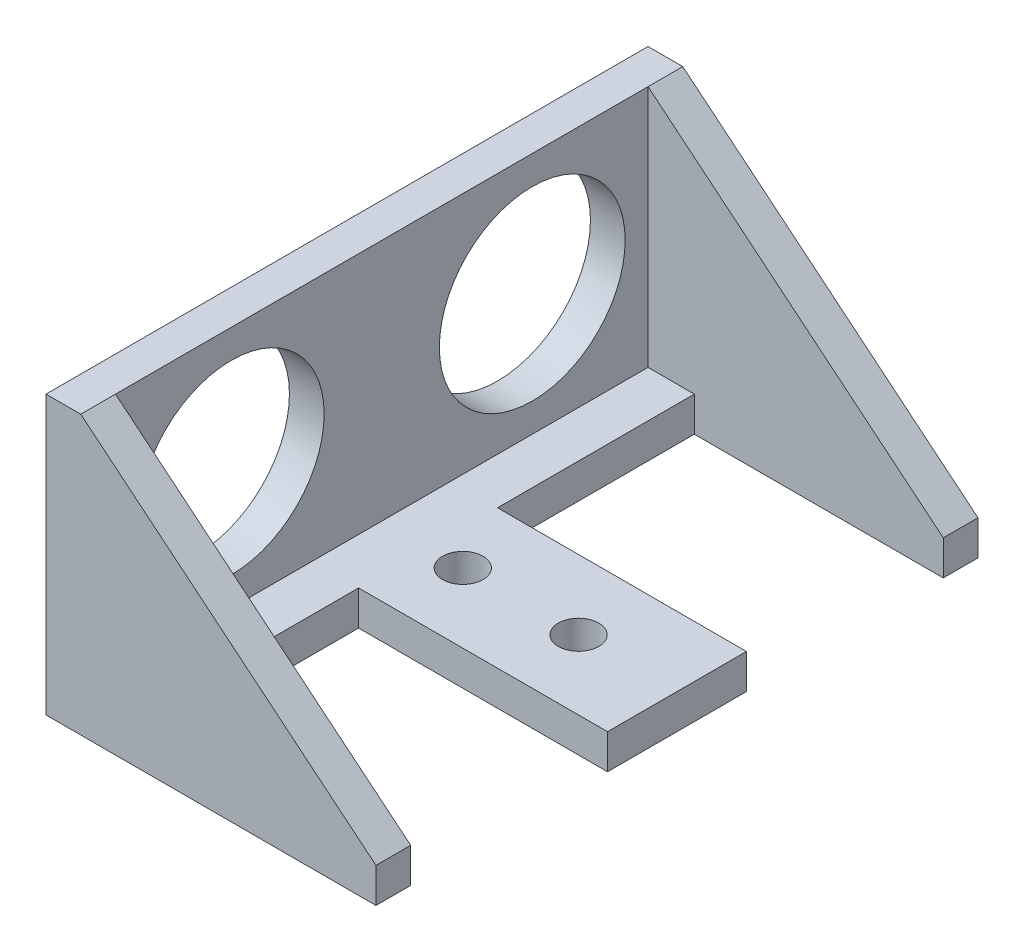
ISO-10303-21;
HEADER;
FILE_DESCRIPTION(('STEP AP214'),'2;1');
FILE_NAME('part.step','',(''),(''),'','','');
FILE_SCHEMA(('AUTOMOTIVE_DESIGN { 1 0 10303 214 1 1 1 1 }'));
ENDSEC;
DATA;
#1=APPLICATION_CONTEXT('core data for automotive mechanical design processes');
#2=APPLICATION_PROTOCOL_DEFINITION('international standard','automotive_design',2000,#1);
#3=PRODUCT_CONTEXT('',#1,'mechanical');
#4=PRODUCT('Part','Part','',(#3));
#5=PRODUCT_RELATED_PRODUCT_CATEGORY('part','',(#4));
#6=PRODUCT_DEFINITION_FORMATION('','',#4);
#7=PRODUCT_DEFINITION_CONTEXT('part definition',#1,'design');
#8=PRODUCT_DEFINITION('design','',#6,#7);
#9=PRODUCT_DEFINITION_SHAPE('','',#8);
#10=(LENGTH_UNIT() NAMED_UNIT(*) SI_UNIT(.MILLI.,.METRE.));
#11=(NAMED_UNIT(*) PLANE_ANGLE_UNIT() SI_UNIT($,.RADIAN.));
#12=(NAMED_UNIT(*) SI_UNIT($,.STERADIAN.) SOLID_ANGLE_UNIT());
#13=UNCERTAINTY_MEASURE_WITH_UNIT(LENGTH_MEASURE(1.E-05),#10,'distance_accuracy_value','');
#14=(GEOMETRIC_REPRESENTATION_CONTEXT(3) GLOBAL_UNCERTAINTY_ASSIGNED_CONTEXT((#13)) GLOBAL_UNIT_ASSIGNED_CONTEXT((#10,
#11,#12)) REPRESENTATION_CONTEXT('',''));
#15=CARTESIAN_POINT('',(0.,0.,0.));
#16=DIRECTION('',(0.,0.,1.));
#17=DIRECTION('',(1.,0.,0.));
#18=AXIS2_PLACEMENT_3D('',#15,#16,#17);
#19=CARTESIAN_POINT('',(28.5,0.,0.));
#20=DIRECTION('',(-1.,0.,0.));
#21=DIRECTION('',(0.,0.,1.));
#22=AXIS2_PLACEMENT_3D('',#19,#20,#21);
#23=PLANE('',#22);
#24=DIRECTION('',(0.,0.,1.));
#25=VECTOR('',#24,1.);
#26=CARTESIAN_POINT('',(28.5,-10.5,-39.));
#27=LINE('',#26,#25);
#28=CARTESIAN_POINT('',(28.5,-10.5,-39.));
#29=VERTEX_POINT('',#28);
#30=CARTESIAN_POINT('',(28.5,-10.5,-36.));
#31=VERTEX_POINT('',#30);
#32=EDGE_CURVE('E256',#29,#31,#27,.T.);
#33=ORIENTED_EDGE('',*,*,#32,.T.);
#34=DIRECTION('',(0.,1.,0.));
#35=VECTOR('',#34,1.);
#36=CARTESIAN_POINT('',(28.5,-13.5,-36.));
#37=LINE('',#36,#35);
#38=CARTESIAN_POINT('',(28.5,-13.5,-36.));
#39=VERTEX_POINT('',#38);
#40=EDGE_CURVE('E215',#39,#31,#37,.T.);
#41=ORIENTED_EDGE('',*,*,#40,.F.);
#42=DIRECTION('',(0.,0.,1.));
#43=VECTOR('',#42,1.);
#44=CARTESIAN_POINT('',(28.5,-13.5,0.));
#45=LINE('',#44,#43);
#46=CARTESIAN_POINT('',(28.5,-13.5,-39.));
#47=VERTEX_POINT('',#46);
#48=EDGE_CURVE('E274',#47,#39,#45,.T.);
#49=ORIENTED_EDGE('',*,*,#48,.F.);
#50=DIRECTION('',(0.,-1.,0.));
#51=VECTOR('',#50,1.);
#52=CARTESIAN_POINT('',(28.5,0.,-39.));
#53=LINE('',#52,#51);
#54=EDGE_CURVE('E271',#29,#47,#53,.T.);
#55=ORIENTED_EDGE('',*,*,#54,.F.);
#56=EDGE_LOOP('',(#33,#41,#49,#55));
#57=FACE_BOUND('',#56,.T.);
#58=ADVANCED_FACE('F71',(#57),#23,.F.);
#59=CARTESIAN_POINT('',(28.5,-13.5,-19.));
#60=VERTEX_POINT('',#59);
#61=CARTESIAN_POINT('',(28.5,-13.5,-7.));
#62=VERTEX_POINT('',#61);
#63=EDGE_CURVE('E277',#60,#62,#45,.T.);
#64=ORIENTED_EDGE('',*,*,#63,.F.);
#65=DIRECTION('',(0.,1.,0.));
#66=VECTOR('',#65,1.);
#67=CARTESIAN_POINT('',(28.5,-13.5,-19.));
#68=LINE('',#67,#66);
#69=CARTESIAN_POINT('',(28.5,-10.5,-19.));
#70=VERTEX_POINT('',#69);
#71=EDGE_CURVE('E191',#60,#70,#68,.T.);
#72=ORIENTED_EDGE('',*,*,#71,.T.);
#73=DIRECTION('',(0.,0.,1.));
#74=VECTOR('',#73,1.);
#75=CARTESIAN_POINT('',(28.5,-10.5,0.));
#76=LINE('',#75,#74);
#77=CARTESIAN_POINT('',(28.5,-10.5,-7.));
#78=VERTEX_POINT('',#77);
#79=EDGE_CURVE('E268',#70,#78,#76,.T.);
#80=ORIENTED_EDGE('',*,*,#79,.T.);
#81=DIRECTION('',(0.,1.,0.));
#82=VECTOR('',#81,1.);
#83=CARTESIAN_POINT('',(28.5,-13.5,-7.));
#84=LINE('',#83,#82);
#85=EDGE_CURVE('E223',#62,#78,#84,.T.);
#86=ORIENTED_EDGE('',*,*,#85,.F.);
#87=EDGE_LOOP('',(#64,#72,#80,#86));
#88=FACE_BOUND('',#87,.T.);
#89=ADVANCED_FACE('F364',(#88),#23,.F.);
#90=CARTESIAN_POINT('',(3.,0.,0.));
#91=DIRECTION('',(1.,0.,0.));
#92=DIRECTION('',(0.,0.,-1.));
#93=AXIS2_PLACEMENT_3D('',#90,#91,#92);
#94=PLANE('',#93);
#95=DIRECTION('',(0.,1.,0.));
#96=VECTOR('',#95,1.);
#97=CARTESIAN_POINT('',(3.,0.,10.));
#98=LINE('',#97,#96);
#99=CARTESIAN_POINT('',(3.,-10.5,10.));
#100=VERTEX_POINT('',#99);
#101=CARTESIAN_POINT('',(3.,10.5,9.99999999999999));
#102=VERTEX_POINT('',#101);
#103=EDGE_CURVE('E292',#100,#102,#98,.T.);
#104=ORIENTED_EDGE('',*,*,#103,.F.);
#105=DIRECTION('',(0.,0.,-1.));
#106=VECTOR('',#105,1.);
#107=CARTESIAN_POINT('',(3.,-10.5,13.));
#108=LINE('',#107,#106);
#109=CARTESIAN_POINT('',(3.,-10.5,-36.));
#110=VERTEX_POINT('',#109);
#111=EDGE_CURVE('E94',#100,#110,#108,.T.);
#112=ORIENTED_EDGE('',*,*,#111,.T.);
#113=DIRECTION('',(0.,1.,0.));
#114=VECTOR('',#113,1.);
#115=CARTESIAN_POINT('',(3.,0.,-36.));
#116=LINE('',#115,#114);
#117=CARTESIAN_POINT('',(3.,10.5,-36.));
#118=VERTEX_POINT('',#117);
#119=EDGE_CURVE('E290',#110,#118,#116,.T.);
#120=ORIENTED_EDGE('',*,*,#119,.T.);
#121=DIRECTION('',(0.,0.,1.));
#122=VECTOR('',#121,1.);
#123=CARTESIAN_POINT('',(3.,10.5,13.));
#124=LINE('',#123,#122);
#125=EDGE_CURVE('E309',#118,#102,#124,.T.);
#126=ORIENTED_EDGE('',*,*,#125,.T.);
#127=EDGE_LOOP('',(#104,#112,#120,#126));
#128=FACE_BOUND('',#127,.T.);
#129=CARTESIAN_POINT('',(3.,0.,0.));
#130=DIRECTION('',(1.,0.,0.));
#131=DIRECTION('',(0.,0.,-1.));
#132=AXIS2_PLACEMENT_3D('',#129,#130,#131);
#133=CIRCLE('',#132,8.025);
#134=CARTESIAN_POINT('',(3.,0.,-8.025));
#135=VERTEX_POINT('',#134);
#136=EDGE_CURVE('E302',#135,#135,#133,.T.);
#137=ORIENTED_EDGE('',*,*,#136,.F.);
#138=EDGE_LOOP('',(#137));
#139=FACE_BOUND('',#138,.T.);
#140=CARTESIAN_POINT('',(3.,0.,-26.));
#141=DIRECTION('',(1.,0.,0.));
#142=DIRECTION('',(0.,0.,-1.));
#143=AXIS2_PLACEMENT_3D('',#140,#141,#142);
#144=CIRCLE('',#143,8.025);
#145=CARTESIAN_POINT('',(3.,0.,-34.025));
#146=VERTEX_POINT('',#145);
#147=EDGE_CURVE('E296',#146,#146,#144,.T.);
#148=ORIENTED_EDGE('',*,*,#147,.F.);
#149=EDGE_LOOP('',(#148));
#150=FACE_BOUND('',#149,.T.);
#151=ADVANCED_FACE('F343',(#128,#139,#150),#94,.T.);
#152=CARTESIAN_POINT('',(0.,0.,0.));
#153=DIRECTION('',(1.,0.,0.));
#154=DIRECTION('',(0.,0.,-1.));
#155=AXIS2_PLACEMENT_3D('',#152,#153,#154);
#156=PLANE('',#155);
#157=DIRECTION('',(0.,-1.,0.));
#158=VECTOR('',#157,1.);
#159=CARTESIAN_POINT('',(0.,10.5,13.));
#160=LINE('',#159,#158);
#161=CARTESIAN_POINT('',(0.,10.5,13.));
#162=VERTEX_POINT('',#161);
#163=CARTESIAN_POINT('',(0.,-13.5,13.));
#164=VERTEX_POINT('',#163);
#165=EDGE_CURVE('E305',#162,#164,#160,.T.);
#166=ORIENTED_EDGE('',*,*,#165,.F.);
#167=DIRECTION('',(0.,0.,1.));
#168=VECTOR('',#167,1.);
#169=CARTESIAN_POINT('',(0.,10.5,13.));
#170=LINE('',#169,#168);
#171=CARTESIAN_POINT('',(0.,10.5,-39.));
#172=VERTEX_POINT('',#171);
#173=EDGE_CURVE('E310',#172,#162,#170,.T.);
#174=ORIENTED_EDGE('',*,*,#173,.F.);
#175=DIRECTION('',(0.,1.,0.));
#176=VECTOR('',#175,1.);
#177=CARTESIAN_POINT('',(0.,10.5,-39.));
#178=LINE('',#177,#176);
#179=CARTESIAN_POINT('',(0.,-13.5,-39.));
#180=VERTEX_POINT('',#179);
#181=EDGE_CURVE('E315',#180,#172,#178,.T.);
#182=ORIENTED_EDGE('',*,*,#181,.F.);
#183=DIRECTION('',(0.,0.,1.));
#184=VECTOR('',#183,1.);
#185=CARTESIAN_POINT('',(0.,-13.5,0.));
#186=LINE('',#185,#184);
#187=EDGE_CURVE('E264',#180,#164,#186,.T.);
#188=ORIENTED_EDGE('',*,*,#187,.T.);
#189=EDGE_LOOP('',(#166,#174,#182,#188));
#190=FACE_BOUND('',#189,.T.);
#191=CARTESIAN_POINT('',(0.,0.,-26.));
#192=DIRECTION('',(1.,0.,0.));
#193=DIRECTION('',(0.,0.,-1.));
#194=AXIS2_PLACEMENT_3D('',#191,#192,#193);
#195=CIRCLE('',#194,8.025);
#196=CARTESIAN_POINT('',(0.,0.,-34.025));
#197=VERTEX_POINT('',#196);
#198=EDGE_CURVE('E295',#197,#197,#195,.T.);
#199=ORIENTED_EDGE('',*,*,#198,.T.);
#200=EDGE_LOOP('',(#199));
#201=FACE_BOUND('',#200,.T.);
#202=CARTESIAN_POINT('',(0.,0.,0.));
#203=DIRECTION('',(1.,0.,0.));
#204=DIRECTION('',(0.,0.,-1.));
#205=AXIS2_PLACEMENT_3D('',#202,#203,#204);
#206=CIRCLE('',#205,8.025);
#207=CARTESIAN_POINT('',(0.,0.,-8.025));
#208=VERTEX_POINT('',#207);
#209=EDGE_CURVE('E299',#208,#208,#206,.T.);
#210=ORIENTED_EDGE('',*,*,#209,.T.);
#211=EDGE_LOOP('',(#210));
#212=FACE_BOUND('',#211,.T.);
#213=ADVANCED_FACE('F333',(#190,#201,#212),#156,.F.);
#214=CARTESIAN_POINT('',(3.,10.5,13.));
#215=DIRECTION('',(0.,0.,-1.));
#216=DIRECTION('',(-1.,0.,0.));
#217=AXIS2_PLACEMENT_3D('',#214,#215,#216);
#218=PLANE('',#217);
#219=DIRECTION('',(0.,-1.,0.));
#220=VECTOR('',#219,1.);
#221=CARTESIAN_POINT('',(28.5,0.,13.));
#222=LINE('',#221,#220);
#223=CARTESIAN_POINT('',(28.5,-10.5,13.));
#224=VERTEX_POINT('',#223);
#225=CARTESIAN_POINT('',(28.5,-13.5,13.));
#226=VERTEX_POINT('',#225);
#227=EDGE_CURVE('E265',#224,#226,#222,.T.);
#228=ORIENTED_EDGE('',*,*,#227,.F.);
#229=DIRECTION('',(0.77193023561705,-0.6357072528611,0.));
#230=VECTOR('',#229,1.);
#231=CARTESIAN_POINT('',(3.,10.5,13.));
#232=LINE('',#231,#230);
#233=CARTESIAN_POINT('',(3.,10.5,13.));
#234=VERTEX_POINT('',#233);
#235=EDGE_CURVE('E86',#234,#224,#232,.T.);
#236=ORIENTED_EDGE('',*,*,#235,.F.);
#237=DIRECTION('',(-1.,0.,0.));
#238=VECTOR('',#237,1.);
#239=CARTESIAN_POINT('',(3.,10.5,13.));
#240=LINE('',#239,#238);
#241=EDGE_CURVE('E313',#234,#162,#240,.T.);
#242=ORIENTED_EDGE('',*,*,#241,.T.);
#243=ORIENTED_EDGE('',*,*,#165,.T.);
#244=DIRECTION('',(-1.,0.,0.));
#245=VECTOR('',#244,1.);
#246=CARTESIAN_POINT('',(28.5,-13.5,13.));
#247=LINE('',#246,#245);
#248=EDGE_CURVE('E280',#226,#164,#247,.T.);
#249=ORIENTED_EDGE('',*,*,#248,.F.);
#250=EDGE_LOOP('',(#228,#236,#242,#243,#249));
#251=FACE_BOUND('',#250,.T.);
#252=ADVANCED_FACE('F73',(#251),#218,.F.);
#253=CARTESIAN_POINT('',(3.,10.5,-39.));
#254=DIRECTION('',(0.,0.,1.));
#255=DIRECTION('',(1.,0.,0.));
#256=AXIS2_PLACEMENT_3D('',#253,#254,#255);
#257=PLANE('',#256);
#258=DIRECTION('',(-1.,0.,0.));
#259=VECTOR('',#258,1.);
#260=CARTESIAN_POINT('',(3.,10.5,-39.));
#261=LINE('',#260,#259);
#262=CARTESIAN_POINT('',(3.,10.5,-39.));
#263=VERTEX_POINT('',#262);
#264=EDGE_CURVE('E79',#263,#172,#261,.T.);
#265=ORIENTED_EDGE('',*,*,#264,.F.);
#266=DIRECTION('',(0.77193023561705,-0.6357072528611,0.));
#267=VECTOR('',#266,1.);
#268=CARTESIAN_POINT('',(3.,10.5,-39.));
#269=LINE('',#268,#267);
#270=EDGE_CURVE('E251',#263,#29,#269,.T.);
#271=ORIENTED_EDGE('',*,*,#270,.T.);
#272=ORIENTED_EDGE('',*,*,#54,.T.);
#273=DIRECTION('',(-1.,0.,0.));
#274=VECTOR('',#273,1.);
#275=CARTESIAN_POINT('',(28.5,-13.5,-39.));
#276=LINE('',#275,#274);
#277=EDGE_CURVE('E284',#47,#180,#276,.T.);
#278=ORIENTED_EDGE('',*,*,#277,.T.);
#279=ORIENTED_EDGE('',*,*,#181,.T.);
#280=EDGE_LOOP('',(#265,#271,#272,#278,#279));
#281=FACE_BOUND('',#280,.T.);
#282=ADVANCED_FACE('F329',(#281),#257,.F.);
#283=CARTESIAN_POINT('',(3.,10.5,13.));
#284=DIRECTION('',(0.,-1.,0.));
#285=DIRECTION('',(0.,0.,-1.));
#286=AXIS2_PLACEMENT_3D('',#283,#284,#285);
#287=PLANE('',#286);
#288=ORIENTED_EDGE('',*,*,#241,.F.);
#289=DIRECTION('',(0.,0.,1.));
#290=VECTOR('',#289,1.);
#291=CARTESIAN_POINT('',(3.,10.5,-39.));
#292=LINE('',#291,#290);
#293=EDGE_CURVE('E254',#102,#234,#292,.T.);
#294=ORIENTED_EDGE('',*,*,#293,.F.);
#295=ORIENTED_EDGE('',*,*,#125,.F.);
#296=EDGE_CURVE('E261',#263,#118,#292,.T.);
#297=ORIENTED_EDGE('',*,*,#296,.F.);
#298=ORIENTED_EDGE('',*,*,#264,.T.);
#299=ORIENTED_EDGE('',*,*,#173,.T.);
#300=EDGE_LOOP('',(#288,#294,#295,#297,#298,#299));
#301=FACE_BOUND('',#300,.T.);
#302=ADVANCED_FACE('F324',(#301),#287,.F.);
#303=CARTESIAN_POINT('',(3.,0.,0.));
#304=DIRECTION('',(-1.,0.,0.));
#305=DIRECTION('',(0.,0.,1.));
#306=AXIS2_PLACEMENT_3D('',#303,#304,#305);
#307=CYLINDRICAL_SURFACE('',#306,8.025);
#308=ORIENTED_EDGE('',*,*,#136,.T.);
#309=EDGE_LOOP('',(#308));
#310=FACE_BOUND('',#309,.T.);
#311=ORIENTED_EDGE('',*,*,#209,.F.);
#312=EDGE_LOOP('',(#311));
#313=FACE_BOUND('',#312,.T.);
#314=ADVANCED_FACE('F513',(#310,#313),#307,.F.);
#315=CARTESIAN_POINT('',(3.,0.,-26.));
#316=DIRECTION('',(-1.,0.,0.));
#317=DIRECTION('',(0.,0.,1.));
#318=AXIS2_PLACEMENT_3D('',#315,#316,#317);
#319=CYLINDRICAL_SURFACE('',#318,8.025);
#320=ORIENTED_EDGE('',*,*,#147,.T.);
#321=EDGE_LOOP('',(#320));
#322=FACE_BOUND('',#321,.T.);
#323=ORIENTED_EDGE('',*,*,#198,.F.);
#324=EDGE_LOOP('',(#323));
#325=FACE_BOUND('',#324,.T.);
#326=ADVANCED_FACE('F379',(#322,#325),#319,.F.);
#327=CARTESIAN_POINT('',(28.5,-10.5,0.));
#328=DIRECTION('',(0.,-1.,0.));
#329=DIRECTION('',(0.,0.,-1.));
#330=AXIS2_PLACEMENT_3D('',#327,#328,#329);
#331=PLANE('',#330);
#332=CARTESIAN_POINT('',(10.,-10.5,-13.));
#333=DIRECTION('',(0.,1.,0.));
#334=DIRECTION('',(0.,0.,1.));
#335=AXIS2_PLACEMENT_3D('',#332,#333,#334);
#336=CIRCLE('',#335,1.75);
#337=CARTESIAN_POINT('',(10.,-10.5,-11.25));
#338=VERTEX_POINT('',#337);
#339=EDGE_CURVE('E243',#338,#338,#336,.T.);
#340=ORIENTED_EDGE('',*,*,#339,.F.);
#341=EDGE_LOOP('',(#340));
#342=FACE_BOUND('',#341,.T.);
#343=CARTESIAN_POINT('',(20.,-10.5,-13.));
#344=DIRECTION('',(0.,1.,0.));
#345=DIRECTION('',(0.,0.,1.));
#346=AXIS2_PLACEMENT_3D('',#343,#344,#345);
#347=CIRCLE('',#346,1.75);
#348=CARTESIAN_POINT('',(20.,-10.5,-11.25));
#349=VERTEX_POINT('',#348);
#350=EDGE_CURVE('E246',#349,#349,#347,.T.);
#351=ORIENTED_EDGE('',*,*,#350,.F.);
#352=EDGE_LOOP('',(#351));
#353=FACE_BOUND('',#352,.T.);
#354=DIRECTION('',(1.,0.,0.));
#355=VECTOR('',#354,1.);
#356=CARTESIAN_POINT('',(7.,-10.5,-19.));
#357=LINE('',#356,#355);
#358=CARTESIAN_POINT('',(7.,-10.5,-19.));
#359=VERTEX_POINT('',#358);
#360=EDGE_CURVE('E205',#359,#70,#357,.T.);
#361=ORIENTED_EDGE('',*,*,#360,.F.);
#362=DIRECTION('',(0.,0.,1.));
#363=VECTOR('',#362,1.);
#364=CARTESIAN_POINT('',(7.,-10.5,-36.));
#365=LINE('',#364,#363);
#366=CARTESIAN_POINT('',(7.,-10.5,-36.));
#367=VERTEX_POINT('',#366);
#368=EDGE_CURVE('E188',#367,#359,#365,.T.);
#369=ORIENTED_EDGE('',*,*,#368,.F.);
#370=DIRECTION('',(1.,0.,0.));
#371=VECTOR('',#370,1.);
#372=CARTESIAN_POINT('',(28.5,-10.5,-36.));
#373=LINE('',#372,#371);
#374=EDGE_CURVE('E283',#110,#367,#373,.T.);
#375=ORIENTED_EDGE('',*,*,#374,.F.);
#376=ORIENTED_EDGE('',*,*,#111,.F.);
#377=DIRECTION('',(-1.,0.,0.));
#378=VECTOR('',#377,1.);
#379=CARTESIAN_POINT('',(28.5,-10.5,10.));
#380=LINE('',#379,#378);
#381=CARTESIAN_POINT('',(7.,-10.5,9.99999999999999));
#382=VERTEX_POINT('',#381);
#383=EDGE_CURVE('E276',#382,#100,#380,.T.);
#384=ORIENTED_EDGE('',*,*,#383,.F.);
#385=DIRECTION('',(0.,0.,1.));
#386=VECTOR('',#385,1.);
#387=CARTESIAN_POINT('',(7.,-10.5,9.99999999999999));
#388=LINE('',#387,#386);
#389=CARTESIAN_POINT('',(7.,-10.5,-7.));
#390=VERTEX_POINT('',#389);
#391=EDGE_CURVE('E210',#390,#382,#388,.T.);
#392=ORIENTED_EDGE('',*,*,#391,.F.);
#393=DIRECTION('',(-1.,0.,0.));
#394=VECTOR('',#393,1.);
#395=CARTESIAN_POINT('',(7.,-10.5,-7.));
#396=LINE('',#395,#394);
#397=EDGE_CURVE('E227',#78,#390,#396,.T.);
#398=ORIENTED_EDGE('',*,*,#397,.F.);
#399=ORIENTED_EDGE('',*,*,#79,.F.);
#400=EDGE_LOOP('',(#361,#369,#375,#376,#384,#392,#398,#399));
#401=FACE_BOUND('',#400,.T.);
#402=ADVANCED_FACE('F351',(#342,#353,#401),#331,.F.);
#403=CARTESIAN_POINT('',(28.5,-13.5,0.));
#404=DIRECTION('',(0.,-1.,0.));
#405=DIRECTION('',(0.,0.,-1.));
#406=AXIS2_PLACEMENT_3D('',#403,#404,#405);
#407=PLANE('',#406);
#408=DIRECTION('',(-1.,0.,0.));
#409=VECTOR('',#408,1.);
#410=CARTESIAN_POINT('',(7.,-13.5,-36.));
#411=LINE('',#410,#409);
#412=CARTESIAN_POINT('',(7.,-13.5,-36.));
#413=VERTEX_POINT('',#412);
#414=EDGE_CURVE('E192',#39,#413,#411,.T.);
#415=ORIENTED_EDGE('',*,*,#414,.T.);
#416=DIRECTION('',(0.,0.,1.));
#417=VECTOR('',#416,1.);
#418=CARTESIAN_POINT('',(7.,-13.5,-36.));
#419=LINE('',#418,#417);
#420=CARTESIAN_POINT('',(7.,-13.5,-19.));
#421=VERTEX_POINT('',#420);
#422=EDGE_CURVE('E185',#413,#421,#419,.T.);
#423=ORIENTED_EDGE('',*,*,#422,.T.);
#424=DIRECTION('',(1.,0.,0.));
#425=VECTOR('',#424,1.);
#426=CARTESIAN_POINT('',(7.,-13.5,-19.));
#427=LINE('',#426,#425);
#428=EDGE_CURVE('E195',#421,#60,#427,.T.);
#429=ORIENTED_EDGE('',*,*,#428,.T.);
#430=ORIENTED_EDGE('',*,*,#63,.T.);
#431=DIRECTION('',(-1.,0.,0.));
#432=VECTOR('',#431,1.);
#433=CARTESIAN_POINT('',(7.,-13.5,-7.));
#434=LINE('',#433,#432);
#435=CARTESIAN_POINT('',(7.,-13.5,-7.));
#436=VERTEX_POINT('',#435);
#437=EDGE_CURVE('E220',#62,#436,#434,.T.);
#438=ORIENTED_EDGE('',*,*,#437,.T.);
#439=DIRECTION('',(0.,0.,1.));
#440=VECTOR('',#439,1.);
#441=CARTESIAN_POINT('',(7.,-13.5,9.99999999999999));
#442=LINE('',#441,#440);
#443=CARTESIAN_POINT('',(7.,-13.5,9.99999999999999));
#444=VERTEX_POINT('',#443);
#445=EDGE_CURVE('E230',#436,#444,#442,.T.);
#446=ORIENTED_EDGE('',*,*,#445,.T.);
#447=DIRECTION('',(1.,0.,0.));
#448=VECTOR('',#447,1.);
#449=CARTESIAN_POINT('',(7.,-13.5,9.99999999999999));
#450=LINE('',#449,#448);
#451=CARTESIAN_POINT('',(28.5,-13.5,9.99999999999999));
#452=VERTEX_POINT('',#451);
#453=EDGE_CURVE('E235',#444,#452,#450,.T.);
#454=ORIENTED_EDGE('',*,*,#453,.T.);
#455=EDGE_CURVE('E273',#452,#226,#45,.T.);
#456=ORIENTED_EDGE('',*,*,#455,.T.);
#457=ORIENTED_EDGE('',*,*,#248,.T.);
#458=ORIENTED_EDGE('',*,*,#187,.F.);
#459=ORIENTED_EDGE('',*,*,#277,.F.);
#460=ORIENTED_EDGE('',*,*,#48,.T.);
#461=EDGE_LOOP('',(#415,#423,#429,#430,#438,#446,#454,#456,#457,#458,#459,#460));
#462=FACE_BOUND('',#461,.T.);
#463=CARTESIAN_POINT('',(10.,-13.5,-13.));
#464=DIRECTION('',(0.,1.,0.));
#465=DIRECTION('',(0.,0.,1.));
#466=AXIS2_PLACEMENT_3D('',#463,#464,#465);
#467=CIRCLE('',#466,1.75);
#468=CARTESIAN_POINT('',(10.,-13.5,-11.25));
#469=VERTEX_POINT('',#468);
#470=EDGE_CURVE('E240',#469,#469,#467,.T.);
#471=ORIENTED_EDGE('',*,*,#470,.T.);
#472=EDGE_LOOP('',(#471));
#473=FACE_BOUND('',#472,.T.);
#474=CARTESIAN_POINT('',(20.,-13.5,-13.));
#475=DIRECTION('',(0.,1.,0.));
#476=DIRECTION('',(0.,0.,1.));
#477=AXIS2_PLACEMENT_3D('',#474,#475,#476);
#478=CIRCLE('',#477,1.75);
#479=CARTESIAN_POINT('',(20.,-13.5,-11.25));
#480=VERTEX_POINT('',#479);
#481=EDGE_CURVE('E214',#480,#480,#478,.T.);
#482=ORIENTED_EDGE('',*,*,#481,.T.);
#483=EDGE_LOOP('',(#482));
#484=FACE_BOUND('',#483,.T.);
#485=ADVANCED_FACE('F202',(#462,#473,#484),#407,.T.);
#486=CARTESIAN_POINT('',(28.5,0.,10.));
#487=DIRECTION('',(0.,0.,-1.));
#488=DIRECTION('',(0.,1.,0.));
#489=AXIS2_PLACEMENT_3D('',#486,#487,#488);
#490=PLANE('',#489);
#491=DIRECTION('',(-0.77193023561705,0.6357072528611,0.));
#492=VECTOR('',#491,1.);
#493=CARTESIAN_POINT('',(23.3474226804124,-6.25670103092784,10.));
#494=LINE('',#493,#492);
#495=CARTESIAN_POINT('',(28.5,-10.5,9.99999999999999));
#496=VERTEX_POINT('',#495);
#497=EDGE_CURVE('E259',#496,#102,#494,.T.);
#498=ORIENTED_EDGE('',*,*,#497,.F.);
#499=DIRECTION('',(0.,1.,0.));
#500=VECTOR('',#499,1.);
#501=CARTESIAN_POINT('',(28.5,-13.5,9.99999999999999));
#502=LINE('',#501,#500);
#503=EDGE_CURVE('E221',#452,#496,#502,.T.);
#504=ORIENTED_EDGE('',*,*,#503,.F.);
#505=ORIENTED_EDGE('',*,*,#453,.F.);
#506=DIRECTION('',(0.,1.,0.));
#507=VECTOR('',#506,1.);
#508=CARTESIAN_POINT('',(7.,-13.5,9.99999999999999));
#509=LINE('',#508,#507);
#510=EDGE_CURVE('E218',#444,#382,#509,.T.);
#511=ORIENTED_EDGE('',*,*,#510,.T.);
#512=ORIENTED_EDGE('',*,*,#383,.T.);
#513=ORIENTED_EDGE('',*,*,#103,.T.);
#514=EDGE_LOOP('',(#498,#504,#505,#511,#512,#513));
#515=FACE_BOUND('',#514,.T.);
#516=ADVANCED_FACE('F347',(#515),#490,.T.);
#517=ORIENTED_EDGE('',*,*,#455,.F.);
#518=ORIENTED_EDGE('',*,*,#503,.T.);
#519=EDGE_CURVE('E260',#496,#224,#27,.T.);
#520=ORIENTED_EDGE('',*,*,#519,.T.);
#521=ORIENTED_EDGE('',*,*,#227,.T.);
#522=EDGE_LOOP('',(#517,#518,#520,#521));
#523=FACE_BOUND('',#522,.T.);
#524=ADVANCED_FACE('F341',(#523),#23,.F.);
#525=CARTESIAN_POINT('',(28.5,10.5,-36.));
#526=DIRECTION('',(0.,0.,-1.));
#527=DIRECTION('',(-1.,0.,0.));
#528=AXIS2_PLACEMENT_3D('',#525,#526,#527);
#529=PLANE('',#528);
#530=ORIENTED_EDGE('',*,*,#374,.T.);
#531=DIRECTION('',(0.,1.,0.));
#532=VECTOR('',#531,1.);
#533=CARTESIAN_POINT('',(7.,-13.5,-36.));
#534=LINE('',#533,#532);
#535=EDGE_CURVE('E212',#413,#367,#534,.T.);
#536=ORIENTED_EDGE('',*,*,#535,.F.);
#537=ORIENTED_EDGE('',*,*,#414,.F.);
#538=ORIENTED_EDGE('',*,*,#40,.T.);
#539=DIRECTION('',(-0.77193023561705,0.6357072528611,0.));
#540=VECTOR('',#539,1.);
#541=CARTESIAN_POINT('',(18.1948453608247,-2.01340206185567,-36.));
#542=LINE('',#541,#540);
#543=EDGE_CURVE('E12',#31,#118,#542,.T.);
#544=ORIENTED_EDGE('',*,*,#543,.T.);
#545=ORIENTED_EDGE('',*,*,#119,.F.);
#546=EDGE_LOOP('',(#530,#536,#537,#538,#544,#545));
#547=FACE_BOUND('',#546,.T.);
#548=ADVANCED_FACE('F355',(#547),#529,.F.);
#549=CARTESIAN_POINT('',(3.,10.5,-39.));
#550=DIRECTION('',(-0.6357072528611,-0.77193023561705,0.));
#551=DIRECTION('',(0.77193023561705,-0.6357072528611,0.));
#552=AXIS2_PLACEMENT_3D('',#549,#550,#551);
#553=PLANE('',#552);
#554=ORIENTED_EDGE('',*,*,#32,.F.);
#555=ORIENTED_EDGE('',*,*,#270,.F.);
#556=ORIENTED_EDGE('',*,*,#296,.T.);
#557=ORIENTED_EDGE('',*,*,#543,.F.);
#558=EDGE_LOOP('',(#554,#555,#556,#557));
#559=FACE_BOUND('',#558,.T.);
#560=ADVANCED_FACE('F359',(#559),#553,.F.);
#561=ORIENTED_EDGE('',*,*,#497,.T.);
#562=ORIENTED_EDGE('',*,*,#293,.T.);
#563=ORIENTED_EDGE('',*,*,#235,.T.);
#564=ORIENTED_EDGE('',*,*,#519,.F.);
#565=EDGE_LOOP('',(#561,#562,#563,#564));
#566=FACE_BOUND('',#565,.T.);
#567=ADVANCED_FACE('F382',(#566),#553,.F.);
#568=CARTESIAN_POINT('',(20.,-13.5,-13.));
#569=DIRECTION('',(0.,1.,0.));
#570=DIRECTION('',(0.,0.,1.));
#571=AXIS2_PLACEMENT_3D('',#568,#569,#570);
#572=CYLINDRICAL_SURFACE('',#571,1.75);
#573=ORIENTED_EDGE('',*,*,#481,.F.);
#574=EDGE_LOOP('',(#573));
#575=FACE_BOUND('',#574,.T.);
#576=ORIENTED_EDGE('',*,*,#350,.T.);
#577=EDGE_LOOP('',(#576));
#578=FACE_BOUND('',#577,.T.);
#579=ADVANCED_FACE('F386',(#575,#578),#572,.F.);
#580=CARTESIAN_POINT('',(10.,-13.5,-13.));
#581=DIRECTION('',(0.,1.,0.));
#582=DIRECTION('',(0.,0.,1.));
#583=AXIS2_PLACEMENT_3D('',#580,#581,#582);
#584=CYLINDRICAL_SURFACE('',#583,1.75);
#585=ORIENTED_EDGE('',*,*,#470,.F.);
#586=EDGE_LOOP('',(#585));
#587=FACE_BOUND('',#586,.T.);
#588=ORIENTED_EDGE('',*,*,#339,.T.);
#589=EDGE_LOOP('',(#588));
#590=FACE_BOUND('',#589,.T.);
#591=ADVANCED_FACE('F390',(#587,#590),#584,.F.);
#592=CARTESIAN_POINT('',(7.,-13.5,-36.));
#593=DIRECTION('',(-1.,0.,0.));
#594=DIRECTION('',(0.,0.,1.));
#595=AXIS2_PLACEMENT_3D('',#592,#593,#594);
#596=PLANE('',#595);
#597=ORIENTED_EDGE('',*,*,#368,.T.);
#598=DIRECTION('',(0.,1.,0.));
#599=VECTOR('',#598,1.);
#600=CARTESIAN_POINT('',(7.,-13.5,-19.));
#601=LINE('',#600,#599);
#602=EDGE_CURVE('E181',#421,#359,#601,.T.);
#603=ORIENTED_EDGE('',*,*,#602,.F.);
#604=ORIENTED_EDGE('',*,*,#422,.F.);
#605=ORIENTED_EDGE('',*,*,#535,.T.);
#606=EDGE_LOOP('',(#597,#603,#604,#605));
#607=FACE_BOUND('',#606,.T.);
#608=ADVANCED_FACE('F183',(#607),#596,.F.);
#609=CARTESIAN_POINT('',(7.,-13.5,-19.));
#610=DIRECTION('',(0.,0.,1.));
#611=DIRECTION('',(1.,0.,0.));
#612=AXIS2_PLACEMENT_3D('',#609,#610,#611);
#613=PLANE('',#612);
#614=ORIENTED_EDGE('',*,*,#360,.T.);
#615=ORIENTED_EDGE('',*,*,#71,.F.);
#616=ORIENTED_EDGE('',*,*,#428,.F.);
#617=ORIENTED_EDGE('',*,*,#602,.T.);
#618=EDGE_LOOP('',(#614,#615,#616,#617));
#619=FACE_BOUND('',#618,.T.);
#620=ADVANCED_FACE('F196',(#619),#613,.F.);
#621=CARTESIAN_POINT('',(7.,-13.5,9.99999999999999));
#622=DIRECTION('',(-1.,0.,0.));
#623=DIRECTION('',(0.,0.,1.));
#624=AXIS2_PLACEMENT_3D('',#621,#622,#623);
#625=PLANE('',#624);
#626=ORIENTED_EDGE('',*,*,#391,.T.);
#627=ORIENTED_EDGE('',*,*,#510,.F.);
#628=ORIENTED_EDGE('',*,*,#445,.F.);
#629=DIRECTION('',(0.,1.,0.));
#630=VECTOR('',#629,1.);
#631=CARTESIAN_POINT('',(7.,-13.5,-7.));
#632=LINE('',#631,#630);
#633=EDGE_CURVE('E225',#436,#390,#632,.T.);
#634=ORIENTED_EDGE('',*,*,#633,.T.);
#635=EDGE_LOOP('',(#626,#627,#628,#634));
#636=FACE_BOUND('',#635,.T.);
#637=ADVANCED_FACE('F397',(#636),#625,.F.);
#638=CARTESIAN_POINT('',(7.,-13.5,-7.));
#639=DIRECTION('',(0.,0.,-1.));
#640=DIRECTION('',(-1.,0.,0.));
#641=AXIS2_PLACEMENT_3D('',#638,#639,#640);
#642=PLANE('',#641);
#643=ORIENTED_EDGE('',*,*,#397,.T.);
#644=ORIENTED_EDGE('',*,*,#633,.F.);
#645=ORIENTED_EDGE('',*,*,#437,.F.);
#646=ORIENTED_EDGE('',*,*,#85,.T.);
#647=EDGE_LOOP('',(#643,#644,#645,#646));
#648=FACE_BOUND('',#647,.T.);
#649=ADVANCED_FACE('F394',(#648),#642,.F.);
#650=CLOSED_SHELL('',(#58,#89,#151,#213,#252,#282,#302,#314,#326,#402,#485,#516,#524,#548,#560,
#567,#579,#591,#608,#620,#637,#649));
#651=MANIFOLD_SOLID_BREP('B2',#650);
#652=ADVANCED_BREP_SHAPE_REPRESENTATION('',(#18,#651),#14);
#653=SHAPE_DEFINITION_REPRESENTATION(#9,#652);
ENDSEC;
END-ISO-10303-21;
